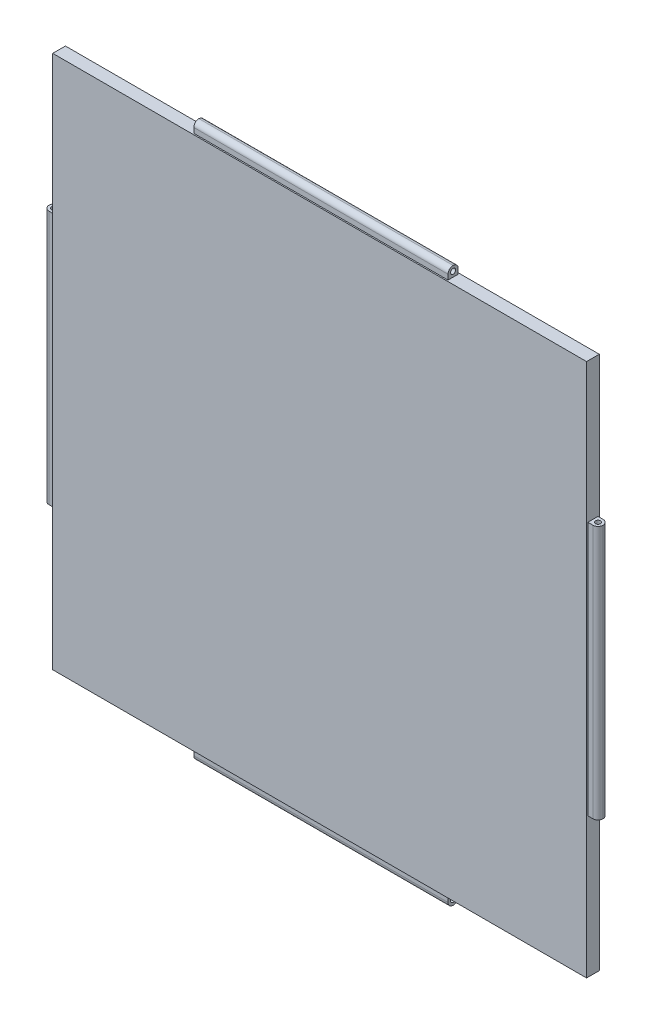
ISO-10303-21;
HEADER;
FILE_DESCRIPTION(('STEP AP214'),'2;1');
FILE_NAME('part.step','',(''),(''),'','','');
FILE_SCHEMA(('AUTOMOTIVE_DESIGN { 1 0 10303 214 1 1 1 1 }'));
ENDSEC;
DATA;
#1=APPLICATION_CONTEXT('core data for automotive mechanical design processes');
#2=APPLICATION_PROTOCOL_DEFINITION('international standard','automotive_design',2000,#1);
#3=PRODUCT_CONTEXT('',#1,'mechanical');
#4=PRODUCT('Part','Part','',(#3));
#5=PRODUCT_RELATED_PRODUCT_CATEGORY('part','',(#4));
#6=PRODUCT_DEFINITION_FORMATION('','',#4);
#7=PRODUCT_DEFINITION_CONTEXT('part definition',#1,'design');
#8=PRODUCT_DEFINITION('design','',#6,#7);
#9=PRODUCT_DEFINITION_SHAPE('','',#8);
#10=(LENGTH_UNIT() NAMED_UNIT(*) SI_UNIT(.MILLI.,.METRE.));
#11=(NAMED_UNIT(*) PLANE_ANGLE_UNIT() SI_UNIT($,.RADIAN.));
#12=(NAMED_UNIT(*) SI_UNIT($,.STERADIAN.) SOLID_ANGLE_UNIT());
#13=UNCERTAINTY_MEASURE_WITH_UNIT(LENGTH_MEASURE(1.E-05),#10,'distance_accuracy_value','');
#14=(GEOMETRIC_REPRESENTATION_CONTEXT(3) GLOBAL_UNCERTAINTY_ASSIGNED_CONTEXT((#13)) GLOBAL_UNIT_ASSIGNED_CONTEXT((#10,
#11,#12)) REPRESENTATION_CONTEXT('',''));
#15=CARTESIAN_POINT('',(0.,0.,0.));
#16=DIRECTION('',(0.,0.,1.));
#17=DIRECTION('',(1.,0.,0.));
#18=AXIS2_PLACEMENT_3D('',#15,#16,#17);
#19=CARTESIAN_POINT('',(-210.,-210.,10.));
#20=DIRECTION('',(0.,1.,0.));
#21=DIRECTION('',(0.,0.,1.));
#22=AXIS2_PLACEMENT_3D('',#19,#20,#21);
#23=PLANE('',#22);
#24=DIRECTION('',(1.,0.,0.));
#25=VECTOR('',#24,1.);
#26=CARTESIAN_POINT('',(-210.,-210.,0.));
#27=LINE('',#26,#25);
#28=CARTESIAN_POINT('',(-210.,-210.,0.));
#29=VERTEX_POINT('',#28);
#30=CARTESIAN_POINT('',(210.,-210.,0.));
#31=VERTEX_POINT('',#30);
#32=EDGE_CURVE('E322',#29,#31,#27,.T.);
#33=ORIENTED_EDGE('',*,*,#32,.T.);
#34=DIRECTION('',(0.,0.,-1.));
#35=VECTOR('',#34,1.);
#36=CARTESIAN_POINT('',(210.,-210.,10.));
#37=LINE('',#36,#35);
#38=CARTESIAN_POINT('',(210.,-210.,10.));
#39=VERTEX_POINT('',#38);
#40=EDGE_CURVE('E331',#39,#31,#37,.T.);
#41=ORIENTED_EDGE('',*,*,#40,.F.);
#42=DIRECTION('',(1.,0.,0.));
#43=VECTOR('',#42,1.);
#44=CARTESIAN_POINT('',(-210.,-210.,10.));
#45=LINE('',#44,#43);
#46=CARTESIAN_POINT('',(-210.,-210.,10.));
#47=VERTEX_POINT('',#46);
#48=EDGE_CURVE('E311',#47,#39,#45,.T.);
#49=ORIENTED_EDGE('',*,*,#48,.F.);
#50=DIRECTION('',(0.,0.,-1.));
#51=VECTOR('',#50,1.);
#52=CARTESIAN_POINT('',(-210.,-210.,10.));
#53=LINE('',#52,#51);
#54=EDGE_CURVE('E329',#47,#29,#53,.T.);
#55=ORIENTED_EDGE('',*,*,#54,.T.);
#56=EDGE_LOOP('',(#33,#41,#49,#55));
#57=FACE_BOUND('',#56,.T.);
#58=DIRECTION('',(-1.,0.,0.));
#59=VECTOR('',#58,1.);
#60=CARTESIAN_POINT('',(100.,-210.,8.99999999999999));
#61=LINE('',#60,#59);
#62=CARTESIAN_POINT('',(100.,-210.,8.99999999999999));
#63=VERTEX_POINT('',#62);
#64=CARTESIAN_POINT('',(-100.,-210.,9.00000000000001));
#65=VERTEX_POINT('',#64);
#66=EDGE_CURVE('E257',#63,#65,#61,.T.);
#67=ORIENTED_EDGE('',*,*,#66,.F.);
#68=DIRECTION('',(0.,0.,1.));
#69=VECTOR('',#68,1.);
#70=CARTESIAN_POINT('',(100.,-210.,0.999999999999988));
#71=LINE('',#70,#69);
#72=CARTESIAN_POINT('',(100.,-210.,0.999999999999988));
#73=VERTEX_POINT('',#72);
#74=EDGE_CURVE('E260',#73,#63,#71,.T.);
#75=ORIENTED_EDGE('',*,*,#74,.F.);
#76=DIRECTION('',(-1.,0.,0.));
#77=VECTOR('',#76,1.);
#78=CARTESIAN_POINT('',(100.,-210.,0.999999999999988));
#79=LINE('',#78,#77);
#80=CARTESIAN_POINT('',(-100.,-210.,1.00000000000001));
#81=VERTEX_POINT('',#80);
#82=EDGE_CURVE('E263',#73,#81,#79,.T.);
#83=ORIENTED_EDGE('',*,*,#82,.T.);
#84=DIRECTION('',(0.,0.,1.));
#85=VECTOR('',#84,1.);
#86=CARTESIAN_POINT('',(-100.,-210.,1.00000000000001));
#87=LINE('',#86,#85);
#88=EDGE_CURVE('E266',#81,#65,#87,.T.);
#89=ORIENTED_EDGE('',*,*,#88,.T.);
#90=EDGE_LOOP('',(#67,#75,#83,#89));
#91=FACE_BOUND('',#90,.T.);
#92=ADVANCED_FACE('F35',(#57,#91),#23,.F.);
#93=CARTESIAN_POINT('',(-210.,210.,10.));
#94=DIRECTION('',(0.,1.,0.));
#95=DIRECTION('',(0.,0.,1.));
#96=AXIS2_PLACEMENT_3D('',#93,#94,#95);
#97=PLANE('',#96);
#98=DIRECTION('',(1.,0.,0.));
#99=VECTOR('',#98,1.);
#100=CARTESIAN_POINT('',(-210.,210.,0.));
#101=LINE('',#100,#99);
#102=CARTESIAN_POINT('',(-210.,210.,0.));
#103=VERTEX_POINT('',#102);
#104=CARTESIAN_POINT('',(210.,210.,0.));
#105=VERTEX_POINT('',#104);
#106=EDGE_CURVE('E299',#103,#105,#101,.T.);
#107=ORIENTED_EDGE('',*,*,#106,.F.);
#108=DIRECTION('',(0.,0.,-1.));
#109=VECTOR('',#108,1.);
#110=CARTESIAN_POINT('',(-210.,210.,10.));
#111=LINE('',#110,#109);
#112=CARTESIAN_POINT('',(-210.,210.,10.));
#113=VERTEX_POINT('',#112);
#114=EDGE_CURVE('E326',#113,#103,#111,.T.);
#115=ORIENTED_EDGE('',*,*,#114,.F.);
#116=DIRECTION('',(1.,0.,0.));
#117=VECTOR('',#116,1.);
#118=CARTESIAN_POINT('',(-210.,210.,10.));
#119=LINE('',#118,#117);
#120=CARTESIAN_POINT('',(210.,210.,10.));
#121=VERTEX_POINT('',#120);
#122=EDGE_CURVE('E305',#113,#121,#119,.T.);
#123=ORIENTED_EDGE('',*,*,#122,.T.);
#124=DIRECTION('',(0.,0.,-1.));
#125=VECTOR('',#124,1.);
#126=CARTESIAN_POINT('',(210.,210.,10.));
#127=LINE('',#126,#125);
#128=EDGE_CURVE('E316',#121,#105,#127,.T.);
#129=ORIENTED_EDGE('',*,*,#128,.T.);
#130=EDGE_LOOP('',(#107,#115,#123,#129));
#131=FACE_BOUND('',#130,.T.);
#132=DIRECTION('',(0.,0.,1.));
#133=VECTOR('',#132,1.);
#134=CARTESIAN_POINT('',(100.,210.,0.999999999999988));
#135=LINE('',#134,#133);
#136=CARTESIAN_POINT('',(100.,210.,0.999999999999988));
#137=VERTEX_POINT('',#136);
#138=CARTESIAN_POINT('',(100.,210.,8.99999999999999));
#139=VERTEX_POINT('',#138);
#140=EDGE_CURVE('E293',#137,#139,#135,.T.);
#141=ORIENTED_EDGE('',*,*,#140,.T.);
#142=DIRECTION('',(-1.,0.,0.));
#143=VECTOR('',#142,1.);
#144=CARTESIAN_POINT('',(100.,210.,8.99999999999999));
#145=LINE('',#144,#143);
#146=CARTESIAN_POINT('',(-100.,210.,9.00000000000001));
#147=VERTEX_POINT('',#146);
#148=EDGE_CURVE('E284',#139,#147,#145,.T.);
#149=ORIENTED_EDGE('',*,*,#148,.T.);
#150=DIRECTION('',(0.,0.,1.));
#151=VECTOR('',#150,1.);
#152=CARTESIAN_POINT('',(-100.,210.,1.00000000000001));
#153=LINE('',#152,#151);
#154=CARTESIAN_POINT('',(-100.,210.,1.00000000000001));
#155=VERTEX_POINT('',#154);
#156=EDGE_CURVE('E287',#155,#147,#153,.T.);
#157=ORIENTED_EDGE('',*,*,#156,.F.);
#158=DIRECTION('',(-1.,0.,0.));
#159=VECTOR('',#158,1.);
#160=CARTESIAN_POINT('',(100.,210.,0.999999999999988));
#161=LINE('',#160,#159);
#162=EDGE_CURVE('E290',#137,#155,#161,.T.);
#163=ORIENTED_EDGE('',*,*,#162,.F.);
#164=EDGE_LOOP('',(#141,#149,#157,#163));
#165=FACE_BOUND('',#164,.T.);
#166=ADVANCED_FACE('F418',(#131,#165),#97,.T.);
#167=CARTESIAN_POINT('',(-210.,-210.,10.));
#168=DIRECTION('',(-1.,0.,0.));
#169=DIRECTION('',(0.,0.,1.));
#170=AXIS2_PLACEMENT_3D('',#167,#168,#169);
#171=PLANE('',#170);
#172=DIRECTION('',(0.,0.,1.));
#173=VECTOR('',#172,1.);
#174=CARTESIAN_POINT('',(-210.,-100.,0.999999999999993));
#175=LINE('',#174,#173);
#176=CARTESIAN_POINT('',(-210.,-100.,0.999999999999993));
#177=VERTEX_POINT('',#176);
#178=CARTESIAN_POINT('',(-210.,-100.,8.99999999999999));
#179=VERTEX_POINT('',#178);
#180=EDGE_CURVE('E230',#177,#179,#175,.T.);
#181=ORIENTED_EDGE('',*,*,#180,.F.);
#182=DIRECTION('',(0.,-1.,0.));
#183=VECTOR('',#182,1.);
#184=CARTESIAN_POINT('',(-210.,100.,0.999999999999969));
#185=LINE('',#184,#183);
#186=CARTESIAN_POINT('',(-210.,100.,0.999999999999969));
#187=VERTEX_POINT('',#186);
#188=EDGE_CURVE('E239',#187,#177,#185,.T.);
#189=ORIENTED_EDGE('',*,*,#188,.F.);
#190=DIRECTION('',(0.,0.,1.));
#191=VECTOR('',#190,1.);
#192=CARTESIAN_POINT('',(-210.,100.,0.999999999999969));
#193=LINE('',#192,#191);
#194=CARTESIAN_POINT('',(-210.,100.,8.99999999999997));
#195=VERTEX_POINT('',#194);
#196=EDGE_CURVE('E236',#187,#195,#193,.T.);
#197=ORIENTED_EDGE('',*,*,#196,.T.);
#198=DIRECTION('',(0.,-1.,0.));
#199=VECTOR('',#198,1.);
#200=CARTESIAN_POINT('',(-210.,100.,8.99999999999997));
#201=LINE('',#200,#199);
#202=EDGE_CURVE('E233',#195,#179,#201,.T.);
#203=ORIENTED_EDGE('',*,*,#202,.T.);
#204=EDGE_LOOP('',(#181,#189,#197,#203));
#205=FACE_BOUND('',#204,.T.);
#206=DIRECTION('',(0.,1.,0.));
#207=VECTOR('',#206,1.);
#208=CARTESIAN_POINT('',(-210.,-210.,0.));
#209=LINE('',#208,#207);
#210=EDGE_CURVE('E309',#29,#103,#209,.T.);
#211=ORIENTED_EDGE('',*,*,#210,.F.);
#212=ORIENTED_EDGE('',*,*,#54,.F.);
#213=DIRECTION('',(0.,1.,0.));
#214=VECTOR('',#213,1.);
#215=CARTESIAN_POINT('',(-210.,-210.,10.));
#216=LINE('',#215,#214);
#217=EDGE_CURVE('E313',#47,#113,#216,.T.);
#218=ORIENTED_EDGE('',*,*,#217,.T.);
#219=ORIENTED_EDGE('',*,*,#114,.T.);
#220=EDGE_LOOP('',(#211,#212,#218,#219));
#221=FACE_BOUND('',#220,.T.);
#222=ADVANCED_FACE('F424',(#205,#221),#171,.T.);
#223=CARTESIAN_POINT('',(210.,-210.,10.));
#224=DIRECTION('',(-1.,0.,0.));
#225=DIRECTION('',(0.,0.,1.));
#226=AXIS2_PLACEMENT_3D('',#223,#224,#225);
#227=PLANE('',#226);
#228=DIRECTION('',(0.,-1.,0.));
#229=VECTOR('',#228,1.);
#230=CARTESIAN_POINT('',(210.,100.,0.999999999999969));
#231=LINE('',#230,#229);
#232=CARTESIAN_POINT('',(210.,100.,0.999999999999969));
#233=VERTEX_POINT('',#232);
#234=CARTESIAN_POINT('',(210.,-100.,0.999999999999993));
#235=VERTEX_POINT('',#234);
#236=EDGE_CURVE('E203',#233,#235,#231,.T.);
#237=ORIENTED_EDGE('',*,*,#236,.T.);
#238=DIRECTION('',(0.,0.,1.));
#239=VECTOR('',#238,1.);
#240=CARTESIAN_POINT('',(210.,-100.,0.999999999999993));
#241=LINE('',#240,#239);
#242=CARTESIAN_POINT('',(210.,-100.,8.99999999999999));
#243=VERTEX_POINT('',#242);
#244=EDGE_CURVE('E209',#235,#243,#241,.T.);
#245=ORIENTED_EDGE('',*,*,#244,.T.);
#246=DIRECTION('',(0.,-1.,0.));
#247=VECTOR('',#246,1.);
#248=CARTESIAN_POINT('',(210.,100.,8.99999999999997));
#249=LINE('',#248,#247);
#250=CARTESIAN_POINT('',(210.,100.,8.99999999999997));
#251=VERTEX_POINT('',#250);
#252=EDGE_CURVE('E214',#251,#243,#249,.T.);
#253=ORIENTED_EDGE('',*,*,#252,.F.);
#254=DIRECTION('',(0.,0.,1.));
#255=VECTOR('',#254,1.);
#256=CARTESIAN_POINT('',(210.,100.,0.999999999999969));
#257=LINE('',#256,#255);
#258=EDGE_CURVE('E195',#233,#251,#257,.T.);
#259=ORIENTED_EDGE('',*,*,#258,.F.);
#260=EDGE_LOOP('',(#237,#245,#253,#259));
#261=FACE_BOUND('',#260,.T.);
#262=DIRECTION('',(0.,1.,0.));
#263=VECTOR('',#262,1.);
#264=CARTESIAN_POINT('',(210.,-210.,0.));
#265=LINE('',#264,#263);
#266=EDGE_CURVE('E319',#31,#105,#265,.T.);
#267=ORIENTED_EDGE('',*,*,#266,.T.);
#268=ORIENTED_EDGE('',*,*,#128,.F.);
#269=DIRECTION('',(0.,1.,0.));
#270=VECTOR('',#269,1.);
#271=CARTESIAN_POINT('',(210.,-210.,10.));
#272=LINE('',#271,#270);
#273=EDGE_CURVE('E308',#39,#121,#272,.T.);
#274=ORIENTED_EDGE('',*,*,#273,.F.);
#275=ORIENTED_EDGE('',*,*,#40,.T.);
#276=EDGE_LOOP('',(#267,#268,#274,#275));
#277=FACE_BOUND('',#276,.T.);
#278=ADVANCED_FACE('F211',(#261,#277),#227,.F.);
#279=CARTESIAN_POINT('',(0.,0.,10.));
#280=DIRECTION('',(0.,0.,1.));
#281=DIRECTION('',(1.,0.,0.));
#282=AXIS2_PLACEMENT_3D('',#279,#280,#281);
#283=PLANE('',#282);
#284=ORIENTED_EDGE('',*,*,#122,.F.);
#285=ORIENTED_EDGE('',*,*,#217,.F.);
#286=ORIENTED_EDGE('',*,*,#48,.T.);
#287=ORIENTED_EDGE('',*,*,#273,.T.);
#288=EDGE_LOOP('',(#284,#285,#286,#287));
#289=FACE_BOUND('',#288,.T.);
#290=ADVANCED_FACE('F432',(#289),#283,.T.);
#291=CARTESIAN_POINT('',(0.,0.,0.));
#292=DIRECTION('',(0.,0.,1.));
#293=DIRECTION('',(1.,0.,0.));
#294=AXIS2_PLACEMENT_3D('',#291,#292,#293);
#295=PLANE('',#294);
#296=ORIENTED_EDGE('',*,*,#106,.T.);
#297=ORIENTED_EDGE('',*,*,#266,.F.);
#298=ORIENTED_EDGE('',*,*,#32,.F.);
#299=ORIENTED_EDGE('',*,*,#210,.T.);
#300=EDGE_LOOP('',(#296,#297,#298,#299));
#301=FACE_BOUND('',#300,.T.);
#302=ADVANCED_FACE('F535',(#301),#295,.F.);
#303=CARTESIAN_POINT('',(100.,218.,8.99999999999999));
#304=DIRECTION('',(0.,0.,1.));
#305=DIRECTION('',(1.,0.,0.));
#306=AXIS2_PLACEMENT_3D('',#303,#304,#305);
#307=PLANE('',#306);
#308=DIRECTION('',(0.,-1.,0.));
#309=VECTOR('',#308,1.);
#310=CARTESIAN_POINT('',(100.,218.,8.99999999999999));
#311=LINE('',#310,#309);
#312=CARTESIAN_POINT('',(100.,214.,8.99999999999999));
#313=VERTEX_POINT('',#312);
#314=EDGE_CURVE('E297',#313,#139,#311,.T.);
#315=ORIENTED_EDGE('',*,*,#314,.F.);
#316=DIRECTION('',(-1.,0.,0.));
#317=VECTOR('',#316,1.);
#318=CARTESIAN_POINT('',(100.,214.,8.99999999999999));
#319=LINE('',#318,#317);
#320=CARTESIAN_POINT('',(-100.,214.,9.00000000000001));
#321=VERTEX_POINT('',#320);
#322=EDGE_CURVE('E345',#313,#321,#319,.T.);
#323=ORIENTED_EDGE('',*,*,#322,.T.);
#324=DIRECTION('',(0.,-1.,0.));
#325=VECTOR('',#324,1.);
#326=CARTESIAN_POINT('',(-100.,218.,9.00000000000001));
#327=LINE('',#326,#325);
#328=EDGE_CURVE('E296',#321,#147,#327,.T.);
#329=ORIENTED_EDGE('',*,*,#328,.T.);
#330=ORIENTED_EDGE('',*,*,#148,.F.);
#331=EDGE_LOOP('',(#315,#323,#329,#330));
#332=FACE_BOUND('',#331,.T.);
#333=ADVANCED_FACE('F525',(#332),#307,.T.);
#334=CARTESIAN_POINT('',(100.,218.,0.999999999999988));
#335=DIRECTION('',(1.,0.,0.));
#336=DIRECTION('',(0.,0.,-1.));
#337=AXIS2_PLACEMENT_3D('',#334,#335,#336);
#338=PLANE('',#337);
#339=CARTESIAN_POINT('',(100.,214.,4.99999999999999));
#340=DIRECTION('',(1.,0.,0.));
#341=DIRECTION('',(0.,0.,-1.));
#342=AXIS2_PLACEMENT_3D('',#339,#340,#341);
#343=CIRCLE('',#342,2.);
#344=CARTESIAN_POINT('',(100.,214.,2.99999999999999));
#345=VERTEX_POINT('',#344);
#346=EDGE_CURVE('E278',#345,#345,#343,.T.);
#347=ORIENTED_EDGE('',*,*,#346,.F.);
#348=EDGE_LOOP('',(#347));
#349=FACE_BOUND('',#348,.T.);
#350=DIRECTION('',(0.,-1.,0.));
#351=VECTOR('',#350,1.);
#352=CARTESIAN_POINT('',(100.,218.,0.999999999999988));
#353=LINE('',#352,#351);
#354=CARTESIAN_POINT('',(100.,214.,0.999999999999988));
#355=VERTEX_POINT('',#354);
#356=EDGE_CURVE('E300',#355,#137,#353,.T.);
#357=ORIENTED_EDGE('',*,*,#356,.F.);
#358=CARTESIAN_POINT('',(100.,214.,4.99999999999999));
#359=DIRECTION('',(1.,0.,0.));
#360=DIRECTION('',(0.,0.,-1.));
#361=AXIS2_PLACEMENT_3D('',#358,#359,#360);
#362=CIRCLE('',#361,4.);
#363=CARTESIAN_POINT('',(100.,218.,4.99999999999999));
#364=VERTEX_POINT('',#363);
#365=EDGE_CURVE('E343',#355,#364,#362,.T.);
#366=ORIENTED_EDGE('',*,*,#365,.T.);
#367=CARTESIAN_POINT('',(100.,214.,4.99999999999999));
#368=DIRECTION('',(1.,0.,0.));
#369=DIRECTION('',(0.,0.,-1.));
#370=AXIS2_PLACEMENT_3D('',#367,#368,#369);
#371=CIRCLE('',#370,4.);
#372=EDGE_CURVE('E341',#364,#313,#371,.T.);
#373=ORIENTED_EDGE('',*,*,#372,.T.);
#374=ORIENTED_EDGE('',*,*,#314,.T.);
#375=ORIENTED_EDGE('',*,*,#140,.F.);
#376=EDGE_LOOP('',(#357,#366,#373,#374,#375));
#377=FACE_BOUND('',#376,.T.);
#378=ADVANCED_FACE('F521',(#349,#377),#338,.T.);
#379=CARTESIAN_POINT('',(100.,218.,0.999999999999988));
#380=DIRECTION('',(0.,0.,1.));
#381=DIRECTION('',(1.,0.,0.));
#382=AXIS2_PLACEMENT_3D('',#379,#380,#381);
#383=PLANE('',#382);
#384=DIRECTION('',(0.,-1.,0.));
#385=VECTOR('',#384,1.);
#386=CARTESIAN_POINT('',(-100.,218.,1.00000000000001));
#387=LINE('',#386,#385);
#388=CARTESIAN_POINT('',(-100.,214.,1.00000000000001));
#389=VERTEX_POINT('',#388);
#390=EDGE_CURVE('E302',#389,#155,#387,.T.);
#391=ORIENTED_EDGE('',*,*,#390,.F.);
#392=DIRECTION('',(-1.,0.,0.));
#393=VECTOR('',#392,1.);
#394=CARTESIAN_POINT('',(100.,214.,0.999999999999988));
#395=LINE('',#394,#393);
#396=EDGE_CURVE('E338',#389,#355,#395,.F.);
#397=ORIENTED_EDGE('',*,*,#396,.T.);
#398=ORIENTED_EDGE('',*,*,#356,.T.);
#399=ORIENTED_EDGE('',*,*,#162,.T.);
#400=EDGE_LOOP('',(#391,#397,#398,#399));
#401=FACE_BOUND('',#400,.T.);
#402=ADVANCED_FACE('F524',(#401),#383,.F.);
#403=CARTESIAN_POINT('',(-100.,218.,1.00000000000001));
#404=DIRECTION('',(1.,0.,0.));
#405=DIRECTION('',(0.,0.,-1.));
#406=AXIS2_PLACEMENT_3D('',#403,#404,#405);
#407=PLANE('',#406);
#408=CARTESIAN_POINT('',(-100.,214.,4.99999999999999));
#409=DIRECTION('',(1.,0.,0.));
#410=DIRECTION('',(0.,0.,-1.));
#411=AXIS2_PLACEMENT_3D('',#408,#409,#410);
#412=CIRCLE('',#411,2.);
#413=CARTESIAN_POINT('',(-100.,214.,2.99999999999999));
#414=VERTEX_POINT('',#413);
#415=EDGE_CURVE('E281',#414,#414,#412,.F.);
#416=ORIENTED_EDGE('',*,*,#415,.F.);
#417=EDGE_LOOP('',(#416));
#418=FACE_BOUND('',#417,.T.);
#419=CARTESIAN_POINT('',(-100.,214.,5.00000000000001));
#420=DIRECTION('',(1.,0.,0.));
#421=DIRECTION('',(0.,0.,-1.));
#422=AXIS2_PLACEMENT_3D('',#419,#420,#421);
#423=CIRCLE('',#422,4.);
#424=CARTESIAN_POINT('',(-100.,218.,5.00000000000001));
#425=VERTEX_POINT('',#424);
#426=EDGE_CURVE('E328',#321,#425,#423,.F.);
#427=ORIENTED_EDGE('',*,*,#426,.T.);
#428=CARTESIAN_POINT('',(-100.,214.,5.00000000000001));
#429=DIRECTION('',(1.,0.,0.));
#430=DIRECTION('',(0.,0.,-1.));
#431=AXIS2_PLACEMENT_3D('',#428,#429,#430);
#432=CIRCLE('',#431,4.);
#433=EDGE_CURVE('E336',#425,#389,#432,.F.);
#434=ORIENTED_EDGE('',*,*,#433,.T.);
#435=ORIENTED_EDGE('',*,*,#390,.T.);
#436=ORIENTED_EDGE('',*,*,#156,.T.);
#437=ORIENTED_EDGE('',*,*,#328,.F.);
#438=EDGE_LOOP('',(#427,#434,#435,#436,#437));
#439=FACE_BOUND('',#438,.T.);
#440=ADVANCED_FACE('F519',(#418,#439),#407,.F.);
#441=CARTESIAN_POINT('',(-210.001,214.,4.99999999999999));
#442=DIRECTION('',(1.,0.,0.));
#443=DIRECTION('',(0.,0.,-1.));
#444=AXIS2_PLACEMENT_3D('',#441,#442,#443);
#445=CYLINDRICAL_SURFACE('',#444,2.);
#446=ORIENTED_EDGE('',*,*,#346,.T.);
#447=EDGE_LOOP('',(#446));
#448=FACE_BOUND('',#447,.T.);
#449=ORIENTED_EDGE('',*,*,#415,.T.);
#450=EDGE_LOOP('',(#449));
#451=FACE_BOUND('',#450,.T.);
#452=ADVANCED_FACE('F442',(#448,#451),#445,.F.);
#453=CARTESIAN_POINT('',(100.,214.,4.99999999999999));
#454=DIRECTION('',(-1.,0.,0.));
#455=DIRECTION('',(0.,0.,1.));
#456=AXIS2_PLACEMENT_3D('',#453,#454,#455);
#457=CYLINDRICAL_SURFACE('',#456,4.);
#458=ORIENTED_EDGE('',*,*,#322,.F.);
#459=ORIENTED_EDGE('',*,*,#372,.F.);
#460=DIRECTION('',(-1.,0.,0.));
#461=VECTOR('',#460,1.);
#462=CARTESIAN_POINT('',(0.,218.,5.));
#463=LINE('',#462,#461);
#464=EDGE_CURVE('E272',#425,#364,#463,.F.);
#465=ORIENTED_EDGE('',*,*,#464,.F.);
#466=ORIENTED_EDGE('',*,*,#426,.F.);
#467=EDGE_LOOP('',(#458,#459,#465,#466));
#468=FACE_BOUND('',#467,.T.);
#469=ADVANCED_FACE('F438',(#468),#457,.T.);
#470=CARTESIAN_POINT('',(0.,214.,5.));
#471=DIRECTION('',(1.,0.,0.));
#472=DIRECTION('',(0.,0.,-1.));
#473=AXIS2_PLACEMENT_3D('',#470,#471,#472);
#474=CYLINDRICAL_SURFACE('',#473,4.);
#475=ORIENTED_EDGE('',*,*,#365,.F.);
#476=ORIENTED_EDGE('',*,*,#396,.F.);
#477=ORIENTED_EDGE('',*,*,#433,.F.);
#478=ORIENTED_EDGE('',*,*,#464,.T.);
#479=EDGE_LOOP('',(#475,#476,#477,#478));
#480=FACE_BOUND('',#479,.T.);
#481=ADVANCED_FACE('F434',(#480),#474,.T.);
#482=CARTESIAN_POINT('',(100.,-218.,8.99999999999999));
#483=DIRECTION('',(0.,0.,-1.));
#484=DIRECTION('',(-1.,0.,0.));
#485=AXIS2_PLACEMENT_3D('',#482,#483,#484);
#486=PLANE('',#485);
#487=DIRECTION('',(0.,1.,0.));
#488=VECTOR('',#487,1.);
#489=CARTESIAN_POINT('',(-100.,-218.,9.00000000000001));
#490=LINE('',#489,#488);
#491=CARTESIAN_POINT('',(-100.,-214.,9.00000000000001));
#492=VERTEX_POINT('',#491);
#493=EDGE_CURVE('E270',#492,#65,#490,.T.);
#494=ORIENTED_EDGE('',*,*,#493,.F.);
#495=DIRECTION('',(-1.,0.,0.));
#496=VECTOR('',#495,1.);
#497=CARTESIAN_POINT('',(100.,-214.,8.99999999999999));
#498=LINE('',#497,#496);
#499=CARTESIAN_POINT('',(100.,-214.,8.99999999999999));
#500=VERTEX_POINT('',#499);
#501=EDGE_CURVE('E360',#492,#500,#498,.F.);
#502=ORIENTED_EDGE('',*,*,#501,.T.);
#503=DIRECTION('',(0.,1.,0.));
#504=VECTOR('',#503,1.);
#505=CARTESIAN_POINT('',(100.,-218.,8.99999999999999));
#506=LINE('',#505,#504);
#507=EDGE_CURVE('E269',#500,#63,#506,.T.);
#508=ORIENTED_EDGE('',*,*,#507,.T.);
#509=ORIENTED_EDGE('',*,*,#66,.T.);
#510=EDGE_LOOP('',(#494,#502,#508,#509));
#511=FACE_BOUND('',#510,.T.);
#512=ADVANCED_FACE('F437',(#511),#486,.F.);
#513=CARTESIAN_POINT('',(-100.,-218.,1.00000000000001));
#514=DIRECTION('',(-1.,0.,0.));
#515=DIRECTION('',(0.,0.,1.));
#516=AXIS2_PLACEMENT_3D('',#513,#514,#515);
#517=PLANE('',#516);
#518=CARTESIAN_POINT('',(-100.,-214.,4.99999999999999));
#519=DIRECTION('',(-1.,0.,0.));
#520=DIRECTION('',(0.,0.,1.));
#521=AXIS2_PLACEMENT_3D('',#518,#519,#520);
#522=CIRCLE('',#521,2.);
#523=CARTESIAN_POINT('',(-100.,-214.,6.99999999999999));
#524=VERTEX_POINT('',#523);
#525=EDGE_CURVE('E254',#524,#524,#522,.T.);
#526=ORIENTED_EDGE('',*,*,#525,.F.);
#527=EDGE_LOOP('',(#526));
#528=FACE_BOUND('',#527,.T.);
#529=DIRECTION('',(0.,1.,0.));
#530=VECTOR('',#529,1.);
#531=CARTESIAN_POINT('',(-100.,-218.,1.00000000000001));
#532=LINE('',#531,#530);
#533=CARTESIAN_POINT('',(-100.,-214.,1.00000000000001));
#534=VERTEX_POINT('',#533);
#535=EDGE_CURVE('E273',#534,#81,#532,.T.);
#536=ORIENTED_EDGE('',*,*,#535,.F.);
#537=CARTESIAN_POINT('',(-100.,-214.,5.00000000000001));
#538=DIRECTION('',(-1.,0.,0.));
#539=DIRECTION('',(0.,0.,1.));
#540=AXIS2_PLACEMENT_3D('',#537,#538,#539);
#541=CIRCLE('',#540,4.);
#542=CARTESIAN_POINT('',(-100.,-218.,5.00000000000001));
#543=VERTEX_POINT('',#542);
#544=EDGE_CURVE('E354',#534,#543,#541,.T.);
#545=ORIENTED_EDGE('',*,*,#544,.T.);
#546=CARTESIAN_POINT('',(-100.,-214.,5.00000000000001));
#547=DIRECTION('',(-1.,0.,0.));
#548=DIRECTION('',(0.,0.,1.));
#549=AXIS2_PLACEMENT_3D('',#546,#547,#548);
#550=CIRCLE('',#549,4.);
#551=EDGE_CURVE('E352',#543,#492,#550,.T.);
#552=ORIENTED_EDGE('',*,*,#551,.T.);
#553=ORIENTED_EDGE('',*,*,#493,.T.);
#554=ORIENTED_EDGE('',*,*,#88,.F.);
#555=EDGE_LOOP('',(#536,#545,#552,#553,#554));
#556=FACE_BOUND('',#555,.T.);
#557=ADVANCED_FACE('F503',(#528,#556),#517,.T.);
#558=CARTESIAN_POINT('',(100.,-218.,0.999999999999988));
#559=DIRECTION('',(0.,0.,-1.));
#560=DIRECTION('',(-1.,0.,0.));
#561=AXIS2_PLACEMENT_3D('',#558,#559,#560);
#562=PLANE('',#561);
#563=DIRECTION('',(0.,1.,0.));
#564=VECTOR('',#563,1.);
#565=CARTESIAN_POINT('',(100.,-218.,0.999999999999988));
#566=LINE('',#565,#564);
#567=CARTESIAN_POINT('',(100.,-214.,0.999999999999988));
#568=VERTEX_POINT('',#567);
#569=EDGE_CURVE('E275',#568,#73,#566,.T.);
#570=ORIENTED_EDGE('',*,*,#569,.F.);
#571=DIRECTION('',(-1.,0.,0.));
#572=VECTOR('',#571,1.);
#573=CARTESIAN_POINT('',(100.,-214.,0.999999999999988));
#574=LINE('',#573,#572);
#575=EDGE_CURVE('E347',#568,#534,#574,.T.);
#576=ORIENTED_EDGE('',*,*,#575,.T.);
#577=ORIENTED_EDGE('',*,*,#535,.T.);
#578=ORIENTED_EDGE('',*,*,#82,.F.);
#579=EDGE_LOOP('',(#570,#576,#577,#578));
#580=FACE_BOUND('',#579,.T.);
#581=ADVANCED_FACE('F506',(#580),#562,.T.);
#582=CARTESIAN_POINT('',(100.,-218.,0.999999999999988));
#583=DIRECTION('',(-1.,0.,0.));
#584=DIRECTION('',(0.,0.,1.));
#585=AXIS2_PLACEMENT_3D('',#582,#583,#584);
#586=PLANE('',#585);
#587=CARTESIAN_POINT('',(100.,-214.,4.99999999999999));
#588=DIRECTION('',(-1.,0.,0.));
#589=DIRECTION('',(0.,0.,-1.));
#590=AXIS2_PLACEMENT_3D('',#587,#588,#589);
#591=CIRCLE('',#590,2.);
#592=CARTESIAN_POINT('',(100.,-214.,2.99999999999999));
#593=VERTEX_POINT('',#592);
#594=EDGE_CURVE('E251',#593,#593,#591,.T.);
#595=ORIENTED_EDGE('',*,*,#594,.T.);
#596=EDGE_LOOP('',(#595));
#597=FACE_BOUND('',#596,.T.);
#598=CARTESIAN_POINT('',(100.,-214.,4.99999999999999));
#599=DIRECTION('',(-1.,0.,0.));
#600=DIRECTION('',(0.,0.,1.));
#601=AXIS2_PLACEMENT_3D('',#598,#599,#600);
#602=CIRCLE('',#601,4.);
#603=CARTESIAN_POINT('',(100.,-218.,4.99999999999999));
#604=VERTEX_POINT('',#603);
#605=EDGE_CURVE('E356',#500,#604,#602,.F.);
#606=ORIENTED_EDGE('',*,*,#605,.T.);
#607=CARTESIAN_POINT('',(100.,-214.,4.99999999999999));
#608=DIRECTION('',(-1.,0.,0.));
#609=DIRECTION('',(0.,0.,1.));
#610=AXIS2_PLACEMENT_3D('',#607,#608,#609);
#611=CIRCLE('',#610,4.);
#612=EDGE_CURVE('E358',#604,#568,#611,.F.);
#613=ORIENTED_EDGE('',*,*,#612,.T.);
#614=ORIENTED_EDGE('',*,*,#569,.T.);
#615=ORIENTED_EDGE('',*,*,#74,.T.);
#616=ORIENTED_EDGE('',*,*,#507,.F.);
#617=EDGE_LOOP('',(#606,#613,#614,#615,#616));
#618=FACE_BOUND('',#617,.T.);
#619=ADVANCED_FACE('F501',(#597,#618),#586,.F.);
#620=CARTESIAN_POINT('',(-210.001,-214.,4.99999999999999));
#621=DIRECTION('',(1.,0.,0.));
#622=DIRECTION('',(0.,0.,-1.));
#623=AXIS2_PLACEMENT_3D('',#620,#621,#622);
#624=CYLINDRICAL_SURFACE('',#623,2.);
#625=ORIENTED_EDGE('',*,*,#525,.T.);
#626=EDGE_LOOP('',(#625));
#627=FACE_BOUND('',#626,.T.);
#628=ORIENTED_EDGE('',*,*,#594,.F.);
#629=EDGE_LOOP('',(#628));
#630=FACE_BOUND('',#629,.T.);
#631=ADVANCED_FACE('F452',(#627,#630),#624,.F.);
#632=CARTESIAN_POINT('',(0.,-214.,5.));
#633=DIRECTION('',(1.,0.,0.));
#634=DIRECTION('',(0.,0.,-1.));
#635=AXIS2_PLACEMENT_3D('',#632,#633,#634);
#636=CYLINDRICAL_SURFACE('',#635,4.);
#637=DIRECTION('',(-1.,0.,0.));
#638=VECTOR('',#637,1.);
#639=CARTESIAN_POINT('',(-100.,-218.,5.00000000000001));
#640=LINE('',#639,#638);
#641=EDGE_CURVE('E250',#604,#543,#640,.T.);
#642=ORIENTED_EDGE('',*,*,#641,.F.);
#643=ORIENTED_EDGE('',*,*,#605,.F.);
#644=ORIENTED_EDGE('',*,*,#501,.F.);
#645=ORIENTED_EDGE('',*,*,#551,.F.);
#646=EDGE_LOOP('',(#642,#643,#644,#645));
#647=FACE_BOUND('',#646,.T.);
#648=ADVANCED_FACE('F448',(#647),#636,.T.);
#649=CARTESIAN_POINT('',(100.,-214.,4.99999999999999));
#650=DIRECTION('',(-1.,0.,0.));
#651=DIRECTION('',(0.,0.,1.));
#652=AXIS2_PLACEMENT_3D('',#649,#650,#651);
#653=CYLINDRICAL_SURFACE('',#652,4.);
#654=ORIENTED_EDGE('',*,*,#612,.F.);
#655=ORIENTED_EDGE('',*,*,#641,.T.);
#656=ORIENTED_EDGE('',*,*,#544,.F.);
#657=ORIENTED_EDGE('',*,*,#575,.F.);
#658=EDGE_LOOP('',(#654,#655,#656,#657));
#659=FACE_BOUND('',#658,.T.);
#660=ADVANCED_FACE('F444',(#659),#653,.T.);
#661=CARTESIAN_POINT('',(-218.,-100.,0.999999999999993));
#662=DIRECTION('',(0.,1.,0.));
#663=DIRECTION('',(0.,0.,1.));
#664=AXIS2_PLACEMENT_3D('',#661,#662,#663);
#665=PLANE('',#664);
#666=CARTESIAN_POINT('',(-214.,-100.,4.99999999999999));
#667=DIRECTION('',(0.,-1.,0.));
#668=DIRECTION('',(0.,0.,-1.));
#669=AXIS2_PLACEMENT_3D('',#666,#667,#668);
#670=CIRCLE('',#669,2.);
#671=CARTESIAN_POINT('',(-214.,-100.,3.));
#672=VERTEX_POINT('',#671);
#673=EDGE_CURVE('E224',#672,#672,#670,.T.);
#674=ORIENTED_EDGE('',*,*,#673,.F.);
#675=EDGE_LOOP('',(#674));
#676=FACE_BOUND('',#675,.T.);
#677=DIRECTION('',(1.,0.,0.));
#678=VECTOR('',#677,1.);
#679=CARTESIAN_POINT('',(-218.,-100.,8.99999999999999));
#680=LINE('',#679,#678);
#681=CARTESIAN_POINT('',(-214.,-100.,8.99999999999999));
#682=VERTEX_POINT('',#681);
#683=EDGE_CURVE('E248',#682,#179,#680,.T.);
#684=ORIENTED_EDGE('',*,*,#683,.F.);
#685=CARTESIAN_POINT('',(-214.,-100.,4.99999999999999));
#686=DIRECTION('',(0.,1.,0.));
#687=DIRECTION('',(0.,0.,1.));
#688=AXIS2_PLACEMENT_3D('',#685,#686,#687);
#689=CIRCLE('',#688,4.);
#690=CARTESIAN_POINT('',(-218.,-100.,4.99999999999999));
#691=VERTEX_POINT('',#690);
#692=EDGE_CURVE('E369',#682,#691,#689,.F.);
#693=ORIENTED_EDGE('',*,*,#692,.T.);
#694=CARTESIAN_POINT('',(-214.,-100.,4.99999999999999));
#695=DIRECTION('',(0.,1.,0.));
#696=DIRECTION('',(0.,0.,1.));
#697=AXIS2_PLACEMENT_3D('',#694,#695,#696);
#698=CIRCLE('',#697,4.);
#699=CARTESIAN_POINT('',(-214.,-100.,0.999999999999993));
#700=VERTEX_POINT('',#699);
#701=EDGE_CURVE('E367',#691,#700,#698,.F.);
#702=ORIENTED_EDGE('',*,*,#701,.T.);
#703=DIRECTION('',(1.,0.,0.));
#704=VECTOR('',#703,1.);
#705=CARTESIAN_POINT('',(-218.,-100.,0.999999999999993));
#706=LINE('',#705,#704);
#707=EDGE_CURVE('E242',#700,#177,#706,.T.);
#708=ORIENTED_EDGE('',*,*,#707,.T.);
#709=ORIENTED_EDGE('',*,*,#180,.T.);
#710=EDGE_LOOP('',(#684,#693,#702,#708,#709));
#711=FACE_BOUND('',#710,.T.);
#712=ADVANCED_FACE('F447',(#676,#711),#665,.F.);
#713=CARTESIAN_POINT('',(-218.,100.,8.99999999999997));
#714=DIRECTION('',(0.,0.,1.));
#715=DIRECTION('',(0.,-1.,0.));
#716=AXIS2_PLACEMENT_3D('',#713,#714,#715);
#717=PLANE('',#716);
#718=DIRECTION('',(1.,0.,0.));
#719=VECTOR('',#718,1.);
#720=CARTESIAN_POINT('',(-218.,100.,8.99999999999997));
#721=LINE('',#720,#719);
#722=CARTESIAN_POINT('',(-214.,100.,8.99999999999997));
#723=VERTEX_POINT('',#722);
#724=EDGE_CURVE('E246',#723,#195,#721,.T.);
#725=ORIENTED_EDGE('',*,*,#724,.F.);
#726=DIRECTION('',(0.,-1.,0.));
#727=VECTOR('',#726,1.);
#728=CARTESIAN_POINT('',(-214.,-100.,8.99999999999999));
#729=LINE('',#728,#727);
#730=EDGE_CURVE('E362',#723,#682,#729,.T.);
#731=ORIENTED_EDGE('',*,*,#730,.T.);
#732=ORIENTED_EDGE('',*,*,#683,.T.);
#733=ORIENTED_EDGE('',*,*,#202,.F.);
#734=EDGE_LOOP('',(#725,#731,#732,#733));
#735=FACE_BOUND('',#734,.T.);
#736=ADVANCED_FACE('F481',(#735),#717,.T.);
#737=CARTESIAN_POINT('',(-218.,100.,0.999999999999969));
#738=DIRECTION('',(0.,1.,0.));
#739=DIRECTION('',(0.,0.,1.));
#740=AXIS2_PLACEMENT_3D('',#737,#738,#739);
#741=PLANE('',#740);
#742=CARTESIAN_POINT('',(-214.,100.,4.99999999999999));
#743=DIRECTION('',(0.,1.,0.));
#744=DIRECTION('',(0.,0.,1.));
#745=AXIS2_PLACEMENT_3D('',#742,#743,#744);
#746=CIRCLE('',#745,2.);
#747=CARTESIAN_POINT('',(-214.,100.,6.99999999999999));
#748=VERTEX_POINT('',#747);
#749=EDGE_CURVE('E223',#748,#748,#746,.F.);
#750=ORIENTED_EDGE('',*,*,#749,.T.);
#751=EDGE_LOOP('',(#750));
#752=FACE_BOUND('',#751,.T.);
#753=CARTESIAN_POINT('',(-214.,100.,4.99999999999997));
#754=DIRECTION('',(0.,1.,0.));
#755=DIRECTION('',(0.,0.,1.));
#756=AXIS2_PLACEMENT_3D('',#753,#754,#755);
#757=CIRCLE('',#756,4.);
#758=CARTESIAN_POINT('',(-214.,100.,0.999999999999969));
#759=VERTEX_POINT('',#758);
#760=CARTESIAN_POINT('',(-218.,100.,4.99999999999997));
#761=VERTEX_POINT('',#760);
#762=EDGE_CURVE('E371',#759,#761,#757,.T.);
#763=ORIENTED_EDGE('',*,*,#762,.T.);
#764=CARTESIAN_POINT('',(-214.,100.,4.99999999999997));
#765=DIRECTION('',(0.,1.,0.));
#766=DIRECTION('',(0.,0.,1.));
#767=AXIS2_PLACEMENT_3D('',#764,#765,#766);
#768=CIRCLE('',#767,4.);
#769=EDGE_CURVE('E373',#761,#723,#768,.T.);
#770=ORIENTED_EDGE('',*,*,#769,.T.);
#771=ORIENTED_EDGE('',*,*,#724,.T.);
#772=ORIENTED_EDGE('',*,*,#196,.F.);
#773=DIRECTION('',(1.,0.,0.));
#774=VECTOR('',#773,1.);
#775=CARTESIAN_POINT('',(-218.,100.,0.999999999999969));
#776=LINE('',#775,#774);
#777=EDGE_CURVE('E244',#759,#187,#776,.T.);
#778=ORIENTED_EDGE('',*,*,#777,.F.);
#779=EDGE_LOOP('',(#763,#770,#771,#772,#778));
#780=FACE_BOUND('',#779,.T.);
#781=ADVANCED_FACE('F466',(#752,#780),#741,.T.);
#782=CARTESIAN_POINT('',(-218.,100.,0.999999999999969));
#783=DIRECTION('',(0.,0.,1.));
#784=DIRECTION('',(0.,-1.,0.));
#785=AXIS2_PLACEMENT_3D('',#782,#783,#784);
#786=PLANE('',#785);
#787=ORIENTED_EDGE('',*,*,#707,.F.);
#788=DIRECTION('',(0.,-1.,0.));
#789=VECTOR('',#788,1.);
#790=CARTESIAN_POINT('',(-214.,100.,0.999999999999969));
#791=LINE('',#790,#789);
#792=EDGE_CURVE('E375',#700,#759,#791,.F.);
#793=ORIENTED_EDGE('',*,*,#792,.T.);
#794=ORIENTED_EDGE('',*,*,#777,.T.);
#795=ORIENTED_EDGE('',*,*,#188,.T.);
#796=EDGE_LOOP('',(#787,#793,#794,#795));
#797=FACE_BOUND('',#796,.T.);
#798=ADVANCED_FACE('F461',(#797),#786,.F.);
#799=CARTESIAN_POINT('',(-214.,0.,4.99999999999998));
#800=DIRECTION('',(0.,-1.,0.));
#801=DIRECTION('',(0.,0.,-1.));
#802=AXIS2_PLACEMENT_3D('',#799,#800,#801);
#803=CYLINDRICAL_SURFACE('',#802,4.);
#804=DIRECTION('',(0.,-1.,0.));
#805=VECTOR('',#804,1.);
#806=CARTESIAN_POINT('',(-218.,0.,4.99999999999998));
#807=LINE('',#806,#805);
#808=EDGE_CURVE('E227',#761,#691,#807,.T.);
#809=ORIENTED_EDGE('',*,*,#808,.F.);
#810=ORIENTED_EDGE('',*,*,#762,.F.);
#811=ORIENTED_EDGE('',*,*,#792,.F.);
#812=ORIENTED_EDGE('',*,*,#701,.F.);
#813=EDGE_LOOP('',(#809,#810,#811,#812));
#814=FACE_BOUND('',#813,.T.);
#815=ADVANCED_FACE('F458',(#814),#803,.T.);
#816=CARTESIAN_POINT('',(-214.,100.,4.99999999999997));
#817=DIRECTION('',(0.,1.,0.));
#818=DIRECTION('',(0.,0.,1.));
#819=AXIS2_PLACEMENT_3D('',#816,#817,#818);
#820=CYLINDRICAL_SURFACE('',#819,4.);
#821=ORIENTED_EDGE('',*,*,#769,.F.);
#822=ORIENTED_EDGE('',*,*,#808,.T.);
#823=ORIENTED_EDGE('',*,*,#692,.F.);
#824=ORIENTED_EDGE('',*,*,#730,.F.);
#825=EDGE_LOOP('',(#821,#822,#823,#824));
#826=FACE_BOUND('',#825,.T.);
#827=ADVANCED_FACE('F454',(#826),#820,.T.);
#828=CARTESIAN_POINT('',(-214.,218.001,4.99999999999999));
#829=DIRECTION('',(0.,-1.,0.));
#830=DIRECTION('',(0.,0.,-1.));
#831=AXIS2_PLACEMENT_3D('',#828,#829,#830);
#832=CYLINDRICAL_SURFACE('',#831,2.);
#833=ORIENTED_EDGE('',*,*,#749,.F.);
#834=EDGE_LOOP('',(#833));
#835=FACE_BOUND('',#834,.T.);
#836=ORIENTED_EDGE('',*,*,#673,.T.);
#837=EDGE_LOOP('',(#836));
#838=FACE_BOUND('',#837,.T.);
#839=ADVANCED_FACE('F457',(#835,#838),#832,.F.);
#840=CARTESIAN_POINT('',(218.,-100.,0.999999999999993));
#841=DIRECTION('',(0.,-1.,0.));
#842=DIRECTION('',(0.,0.,-1.));
#843=AXIS2_PLACEMENT_3D('',#840,#841,#842);
#844=PLANE('',#843);
#845=CARTESIAN_POINT('',(214.,-100.,4.99999999999999));
#846=DIRECTION('',(0.,1.,0.));
#847=DIRECTION('',(0.,0.,-1.));
#848=AXIS2_PLACEMENT_3D('',#845,#846,#847);
#849=CIRCLE('',#848,2.);
#850=CARTESIAN_POINT('',(214.,-100.,3.));
#851=VERTEX_POINT('',#850);
#852=EDGE_CURVE('E398',#851,#851,#849,.T.);
#853=ORIENTED_EDGE('',*,*,#852,.T.);
#854=EDGE_LOOP('',(#853));
#855=FACE_BOUND('',#854,.T.);
#856=CARTESIAN_POINT('',(214.,-100.,4.99999999999999));
#857=DIRECTION('',(0.,-1.,0.));
#858=DIRECTION('',(0.,0.,-1.));
#859=AXIS2_PLACEMENT_3D('',#856,#857,#858);
#860=CIRCLE('',#859,4.);
#861=CARTESIAN_POINT('',(214.,-100.,0.999999999999993));
#862=VERTEX_POINT('',#861);
#863=CARTESIAN_POINT('',(218.,-100.,4.99999999999999));
#864=VERTEX_POINT('',#863);
#865=EDGE_CURVE('E377',#862,#864,#860,.T.);
#866=ORIENTED_EDGE('',*,*,#865,.T.);
#867=CARTESIAN_POINT('',(214.,-100.,4.99999999999999));
#868=DIRECTION('',(0.,-1.,0.));
#869=DIRECTION('',(0.,0.,-1.));
#870=AXIS2_PLACEMENT_3D('',#867,#868,#869);
#871=CIRCLE('',#870,4.);
#872=CARTESIAN_POINT('',(214.,-100.,8.99999999999999));
#873=VERTEX_POINT('',#872);
#874=EDGE_CURVE('E381',#864,#873,#871,.T.);
#875=ORIENTED_EDGE('',*,*,#874,.T.);
#876=DIRECTION('',(-1.,0.,0.));
#877=VECTOR('',#876,1.);
#878=CARTESIAN_POINT('',(218.,-100.,8.99999999999999));
#879=LINE('',#878,#877);
#880=EDGE_CURVE('E216',#873,#243,#879,.T.);
#881=ORIENTED_EDGE('',*,*,#880,.T.);
#882=ORIENTED_EDGE('',*,*,#244,.F.);
#883=DIRECTION('',(-1.,0.,0.));
#884=VECTOR('',#883,1.);
#885=CARTESIAN_POINT('',(218.,-100.,0.999999999999993));
#886=LINE('',#885,#884);
#887=EDGE_CURVE('E199',#862,#235,#886,.T.);
#888=ORIENTED_EDGE('',*,*,#887,.F.);
#889=EDGE_LOOP('',(#866,#875,#881,#882,#888));
#890=FACE_BOUND('',#889,.T.);
#891=ADVANCED_FACE('F704',(#855,#890),#844,.T.);
#892=CARTESIAN_POINT('',(218.,100.,0.999999999999969));
#893=DIRECTION('',(0.,0.,-1.));
#894=DIRECTION('',(0.,1.,0.));
#895=AXIS2_PLACEMENT_3D('',#892,#893,#894);
#896=PLANE('',#895);
#897=DIRECTION('',(-1.,0.,0.));
#898=VECTOR('',#897,1.);
#899=CARTESIAN_POINT('',(218.,100.,0.999999999999969));
#900=LINE('',#899,#898);
#901=CARTESIAN_POINT('',(214.,100.,0.999999999999969));
#902=VERTEX_POINT('',#901);
#903=EDGE_CURVE('E191',#902,#233,#900,.T.);
#904=ORIENTED_EDGE('',*,*,#903,.F.);
#905=DIRECTION('',(0.,-1.,0.));
#906=VECTOR('',#905,1.);
#907=CARTESIAN_POINT('',(214.,-100.,0.999999999999993));
#908=LINE('',#907,#906);
#909=EDGE_CURVE('E11',#902,#862,#908,.T.);
#910=ORIENTED_EDGE('',*,*,#909,.T.);
#911=ORIENTED_EDGE('',*,*,#887,.T.);
#912=ORIENTED_EDGE('',*,*,#236,.F.);
#913=EDGE_LOOP('',(#904,#910,#911,#912));
#914=FACE_BOUND('',#913,.T.);
#915=ADVANCED_FACE('F204',(#914),#896,.T.);
#916=CARTESIAN_POINT('',(218.,100.,0.999999999999969));
#917=DIRECTION('',(0.,-1.,0.));
#918=DIRECTION('',(0.,0.,-1.));
#919=AXIS2_PLACEMENT_3D('',#916,#917,#918);
#920=PLANE('',#919);
#921=CARTESIAN_POINT('',(214.,100.,4.99999999999999));
#922=DIRECTION('',(0.,-1.,0.));
#923=DIRECTION('',(0.,0.,-1.));
#924=AXIS2_PLACEMENT_3D('',#921,#922,#923);
#925=CIRCLE('',#924,2.);
#926=CARTESIAN_POINT('',(214.,100.,3.));
#927=VERTEX_POINT('',#926);
#928=EDGE_CURVE('E400',#927,#927,#925,.T.);
#929=ORIENTED_EDGE('',*,*,#928,.T.);
#930=EDGE_LOOP('',(#929));
#931=FACE_BOUND('',#930,.T.);
#932=DIRECTION('',(-1.,0.,0.));
#933=VECTOR('',#932,1.);
#934=CARTESIAN_POINT('',(218.,100.,8.99999999999997));
#935=LINE('',#934,#933);
#936=CARTESIAN_POINT('',(214.,100.,8.99999999999997));
#937=VERTEX_POINT('',#936);
#938=EDGE_CURVE('E200',#937,#251,#935,.T.);
#939=ORIENTED_EDGE('',*,*,#938,.F.);
#940=CARTESIAN_POINT('',(214.,100.,4.99999999999997));
#941=DIRECTION('',(0.,-1.,0.));
#942=DIRECTION('',(0.,0.,-1.));
#943=AXIS2_PLACEMENT_3D('',#940,#941,#942);
#944=CIRCLE('',#943,4.);
#945=CARTESIAN_POINT('',(218.,100.,4.99999999999997));
#946=VERTEX_POINT('',#945);
#947=EDGE_CURVE('E44',#937,#946,#944,.F.);
#948=ORIENTED_EDGE('',*,*,#947,.T.);
#949=CARTESIAN_POINT('',(214.,100.,4.99999999999997));
#950=DIRECTION('',(0.,-1.,0.));
#951=DIRECTION('',(0.,0.,-1.));
#952=AXIS2_PLACEMENT_3D('',#949,#950,#951);
#953=CIRCLE('',#952,4.);
#954=EDGE_CURVE('E51',#946,#902,#953,.F.);
#955=ORIENTED_EDGE('',*,*,#954,.T.);
#956=ORIENTED_EDGE('',*,*,#903,.T.);
#957=ORIENTED_EDGE('',*,*,#258,.T.);
#958=EDGE_LOOP('',(#939,#948,#955,#956,#957));
#959=FACE_BOUND('',#958,.T.);
#960=ADVANCED_FACE('F193',(#931,#959),#920,.F.);
#961=CARTESIAN_POINT('',(218.,100.,8.99999999999997));
#962=DIRECTION('',(0.,0.,-1.));
#963=DIRECTION('',(0.,1.,0.));
#964=AXIS2_PLACEMENT_3D('',#961,#962,#963);
#965=PLANE('',#964);
#966=ORIENTED_EDGE('',*,*,#880,.F.);
#967=DIRECTION('',(0.,-1.,0.));
#968=VECTOR('',#967,1.);
#969=CARTESIAN_POINT('',(214.,100.,8.99999999999997));
#970=LINE('',#969,#968);
#971=EDGE_CURVE('E383',#873,#937,#970,.F.);
#972=ORIENTED_EDGE('',*,*,#971,.T.);
#973=ORIENTED_EDGE('',*,*,#938,.T.);
#974=ORIENTED_EDGE('',*,*,#252,.T.);
#975=EDGE_LOOP('',(#966,#972,#973,#974));
#976=FACE_BOUND('',#975,.T.);
#977=ADVANCED_FACE('F390',(#976),#965,.F.);
#978=CARTESIAN_POINT('',(214.,100.,4.99999999999997));
#979=DIRECTION('',(0.,1.,0.));
#980=DIRECTION('',(0.,0.,1.));
#981=AXIS2_PLACEMENT_3D('',#978,#979,#980);
#982=CYLINDRICAL_SURFACE('',#981,4.);
#983=ORIENTED_EDGE('',*,*,#909,.F.);
#984=ORIENTED_EDGE('',*,*,#954,.F.);
#985=DIRECTION('',(0.,-1.,0.));
#986=VECTOR('',#985,1.);
#987=CARTESIAN_POINT('',(218.,100.,4.99999999999997));
#988=LINE('',#987,#986);
#989=EDGE_CURVE('E39',#864,#946,#988,.F.);
#990=ORIENTED_EDGE('',*,*,#989,.F.);
#991=ORIENTED_EDGE('',*,*,#865,.F.);
#992=EDGE_LOOP('',(#983,#984,#990,#991));
#993=FACE_BOUND('',#992,.T.);
#994=ADVANCED_FACE('F37',(#993),#982,.T.);
#995=CARTESIAN_POINT('',(214.,0.,4.99999999999998));
#996=DIRECTION('',(0.,-1.,0.));
#997=DIRECTION('',(0.,0.,-1.));
#998=AXIS2_PLACEMENT_3D('',#995,#996,#997);
#999=CYLINDRICAL_SURFACE('',#998,4.);
#1000=ORIENTED_EDGE('',*,*,#947,.F.);
#1001=ORIENTED_EDGE('',*,*,#971,.F.);
#1002=ORIENTED_EDGE('',*,*,#874,.F.);
#1003=ORIENTED_EDGE('',*,*,#989,.T.);
#1004=EDGE_LOOP('',(#1000,#1001,#1002,#1003));
#1005=FACE_BOUND('',#1004,.T.);
#1006=ADVANCED_FACE('F393',(#1005),#999,.T.);
#1007=CARTESIAN_POINT('',(214.,218.001,4.99999999999999));
#1008=DIRECTION('',(0.,-1.,0.));
#1009=DIRECTION('',(0.,0.,-1.));
#1010=AXIS2_PLACEMENT_3D('',#1007,#1008,#1009);
#1011=CYLINDRICAL_SURFACE('',#1010,2.);
#1012=ORIENTED_EDGE('',*,*,#852,.F.);
#1013=EDGE_LOOP('',(#1012));
#1014=FACE_BOUND('',#1013,.T.);
#1015=ORIENTED_EDGE('',*,*,#928,.F.);
#1016=EDGE_LOOP('',(#1015));
#1017=FACE_BOUND('',#1016,.T.);
#1018=ADVANCED_FACE('F409',(#1014,#1017),#1011,.F.);
#1019=CLOSED_SHELL('',(#92,#166,#222,#278,#290,#302,#333,#378,#402,#440,#452,#469,#481,#512,
#557,#581,#619,#631,#648,#660,#712,#736,#781,#798,#815,#827,#839,#891,#915,#960,#977,#994,#1006,#1018));
#1020=MANIFOLD_SOLID_BREP('B2',#1019);
#1021=ADVANCED_BREP_SHAPE_REPRESENTATION('',(#18,#1020),#14);
#1022=SHAPE_DEFINITION_REPRESENTATION(#9,#1021);
ENDSEC;
END-ISO-10303-21;
